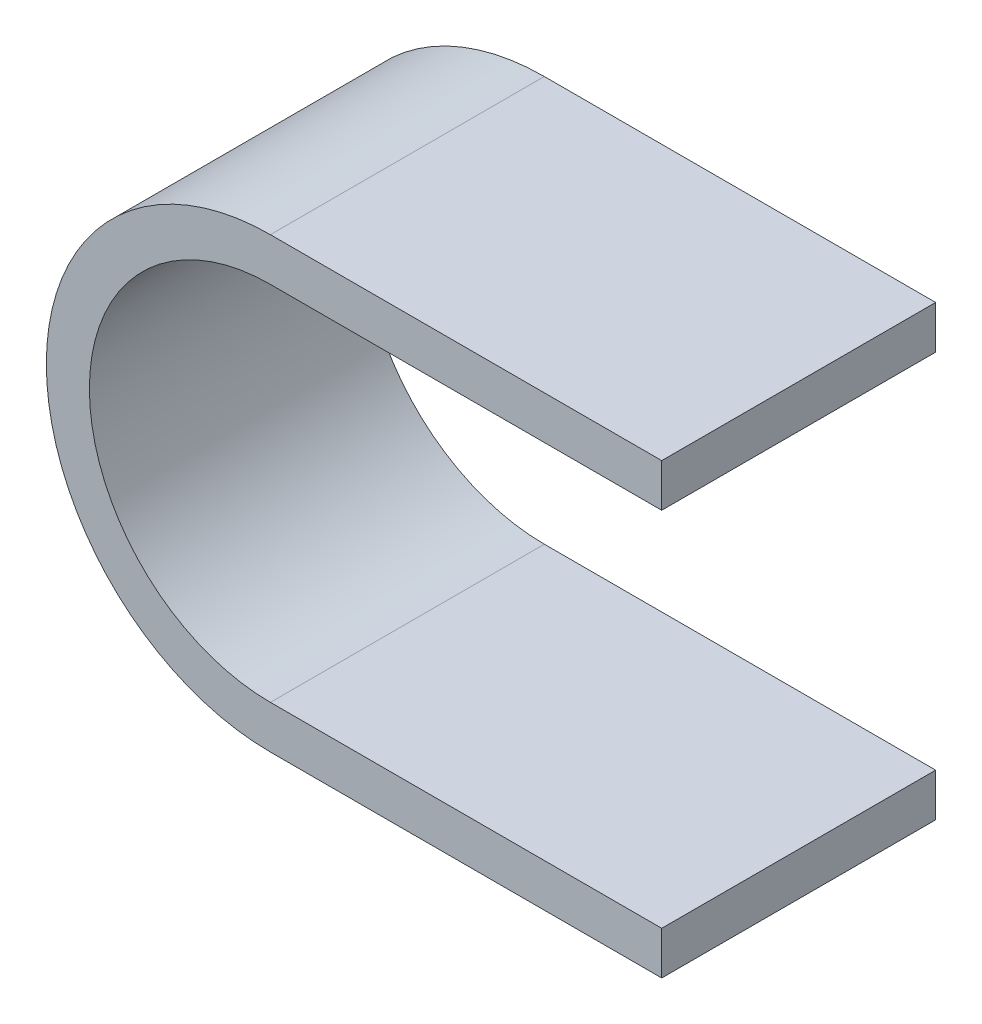
ISO-10303-21;
HEADER;
FILE_DESCRIPTION(('STEP AP214'),'2;1');
FILE_NAME('part.step','',(''),(''),'','','');
FILE_SCHEMA(('AUTOMOTIVE_DESIGN { 1 0 10303 214 1 1 1 1 }'));
ENDSEC;
DATA;
#1=APPLICATION_CONTEXT('core data for automotive mechanical design processes');
#2=APPLICATION_PROTOCOL_DEFINITION('international standard','automotive_design',2000,#1);
#3=PRODUCT_CONTEXT('',#1,'mechanical');
#4=PRODUCT('Part','Part','',(#3));
#5=PRODUCT_RELATED_PRODUCT_CATEGORY('part','',(#4));
#6=PRODUCT_DEFINITION_FORMATION('','',#4);
#7=PRODUCT_DEFINITION_CONTEXT('part definition',#1,'design');
#8=PRODUCT_DEFINITION('design','',#6,#7);
#9=PRODUCT_DEFINITION_SHAPE('','',#8);
#10=(LENGTH_UNIT() NAMED_UNIT(*) SI_UNIT(.MILLI.,.METRE.));
#11=(NAMED_UNIT(*) PLANE_ANGLE_UNIT() SI_UNIT($,.RADIAN.));
#12=(NAMED_UNIT(*) SI_UNIT($,.STERADIAN.) SOLID_ANGLE_UNIT());
#13=UNCERTAINTY_MEASURE_WITH_UNIT(LENGTH_MEASURE(1.E-05),#10,'distance_accuracy_value','');
#14=(GEOMETRIC_REPRESENTATION_CONTEXT(3) GLOBAL_UNCERTAINTY_ASSIGNED_CONTEXT((#13)) GLOBAL_UNIT_ASSIGNED_CONTEXT((#10,
#11,#12)) REPRESENTATION_CONTEXT('',''));
#15=CARTESIAN_POINT('',(0.,0.,0.));
#16=DIRECTION('',(0.,0.,1.));
#17=DIRECTION('',(1.,0.,0.));
#18=AXIS2_PLACEMENT_3D('',#15,#16,#17);
#19=CARTESIAN_POINT('',(0.,22.9,28.));
#20=DIRECTION('',(0.,1.,0.));
#21=DIRECTION('',(0.,0.,1.));
#22=AXIS2_PLACEMENT_3D('',#19,#20,#21);
#23=PLANE('',#22);
#24=DIRECTION('',(1.,0.,0.));
#25=VECTOR('',#24,1.);
#26=CARTESIAN_POINT('',(0.,22.9,0.));
#27=LINE('',#26,#25);
#28=CARTESIAN_POINT('',(0.,22.9,0.));
#29=VERTEX_POINT('',#28);
#30=CARTESIAN_POINT('',(40.,22.9,0.));
#31=VERTEX_POINT('',#30);
#32=EDGE_CURVE('E146',#29,#31,#27,.T.);
#33=ORIENTED_EDGE('',*,*,#32,.F.);
#34=DIRECTION('',(0.,0.,-1.));
#35=VECTOR('',#34,1.);
#36=CARTESIAN_POINT('',(0.,22.9,28.));
#37=LINE('',#36,#35);
#38=CARTESIAN_POINT('',(0.,22.9,28.));
#39=VERTEX_POINT('',#38);
#40=EDGE_CURVE('E11',#39,#29,#37,.T.);
#41=ORIENTED_EDGE('',*,*,#40,.F.);
#42=DIRECTION('',(1.,0.,0.));
#43=VECTOR('',#42,1.);
#44=CARTESIAN_POINT('',(0.,22.9,28.));
#45=LINE('',#44,#43);
#46=CARTESIAN_POINT('',(40.,22.9,28.));
#47=VERTEX_POINT('',#46);
#48=EDGE_CURVE('E172',#39,#47,#45,.T.);
#49=ORIENTED_EDGE('',*,*,#48,.T.);
#50=DIRECTION('',(0.,0.,-1.));
#51=VECTOR('',#50,1.);
#52=CARTESIAN_POINT('',(40.,22.9,28.));
#53=LINE('',#52,#51);
#54=EDGE_CURVE('E62',#47,#31,#53,.T.);
#55=ORIENTED_EDGE('',*,*,#54,.T.);
#56=EDGE_LOOP('',(#33,#41,#49,#55));
#57=FACE_BOUND('',#56,.T.);
#58=ADVANCED_FACE('F45',(#57),#23,.T.);
#59=CARTESIAN_POINT('',(0.,0.,28.));
#60=DIRECTION('',(0.,0.,-1.));
#61=DIRECTION('',(-1.,0.,0.));
#62=AXIS2_PLACEMENT_3D('',#59,#60,#61);
#63=CYLINDRICAL_SURFACE('',#62,22.9);
#64=CARTESIAN_POINT('',(0.,0.,0.));
#65=DIRECTION('',(0.,0.,1.));
#66=DIRECTION('',(1.,0.,0.));
#67=AXIS2_PLACEMENT_3D('',#64,#65,#66);
#68=CIRCLE('',#67,22.9);
#69=CARTESIAN_POINT('',(0.,-22.9,0.));
#70=VERTEX_POINT('',#69);
#71=EDGE_CURVE('E149',#29,#70,#68,.T.);
#72=ORIENTED_EDGE('',*,*,#71,.T.);
#73=DIRECTION('',(0.,0.,-1.));
#74=VECTOR('',#73,1.);
#75=CARTESIAN_POINT('',(0.,-22.9,28.));
#76=LINE('',#75,#74);
#77=CARTESIAN_POINT('',(0.,-22.9,28.));
#78=VERTEX_POINT('',#77);
#79=EDGE_CURVE('E54',#78,#70,#76,.T.);
#80=ORIENTED_EDGE('',*,*,#79,.F.);
#81=CARTESIAN_POINT('',(0.,0.,28.));
#82=DIRECTION('',(0.,0.,1.));
#83=DIRECTION('',(1.,0.,0.));
#84=AXIS2_PLACEMENT_3D('',#81,#82,#83);
#85=CIRCLE('',#84,22.9);
#86=EDGE_CURVE('E206',#39,#78,#85,.T.);
#87=ORIENTED_EDGE('',*,*,#86,.F.);
#88=ORIENTED_EDGE('',*,*,#40,.T.);
#89=EDGE_LOOP('',(#72,#80,#87,#88));
#90=FACE_BOUND('',#89,.T.);
#91=ADVANCED_FACE('F223',(#90),#63,.T.);
#92=CARTESIAN_POINT('',(0.,-22.9,28.));
#93=DIRECTION('',(0.,1.,0.));
#94=DIRECTION('',(0.,0.,1.));
#95=AXIS2_PLACEMENT_3D('',#92,#93,#94);
#96=PLANE('',#95);
#97=DIRECTION('',(1.,0.,0.));
#98=VECTOR('',#97,1.);
#99=CARTESIAN_POINT('',(0.,-22.9,0.));
#100=LINE('',#99,#98);
#101=CARTESIAN_POINT('',(40.,-22.9,0.));
#102=VERTEX_POINT('',#101);
#103=EDGE_CURVE('E152',#70,#102,#100,.T.);
#104=ORIENTED_EDGE('',*,*,#103,.T.);
#105=DIRECTION('',(0.,0.,-1.));
#106=VECTOR('',#105,1.);
#107=CARTESIAN_POINT('',(40.,-22.9,28.));
#108=LINE('',#107,#106);
#109=CARTESIAN_POINT('',(40.,-22.9,28.));
#110=VERTEX_POINT('',#109);
#111=EDGE_CURVE('E182',#110,#102,#108,.T.);
#112=ORIENTED_EDGE('',*,*,#111,.F.);
#113=DIRECTION('',(1.,0.,0.));
#114=VECTOR('',#113,1.);
#115=CARTESIAN_POINT('',(0.,-22.9,28.));
#116=LINE('',#115,#114);
#117=EDGE_CURVE('E193',#78,#110,#116,.T.);
#118=ORIENTED_EDGE('',*,*,#117,.F.);
#119=ORIENTED_EDGE('',*,*,#79,.T.);
#120=EDGE_LOOP('',(#104,#112,#118,#119));
#121=FACE_BOUND('',#120,.T.);
#122=ADVANCED_FACE('F191',(#121),#96,.F.);
#123=CARTESIAN_POINT('',(40.,0.,28.));
#124=DIRECTION('',(-1.,0.,0.));
#125=DIRECTION('',(0.,0.,1.));
#126=AXIS2_PLACEMENT_3D('',#123,#124,#125);
#127=PLANE('',#126);
#128=DIRECTION('',(0.,1.,0.));
#129=VECTOR('',#128,1.);
#130=CARTESIAN_POINT('',(40.,0.,0.));
#131=LINE('',#130,#129);
#132=CARTESIAN_POINT('',(40.,-18.5,0.));
#133=VERTEX_POINT('',#132);
#134=EDGE_CURVE('E155',#102,#133,#131,.T.);
#135=ORIENTED_EDGE('',*,*,#134,.T.);
#136=DIRECTION('',(0.,0.,-1.));
#137=VECTOR('',#136,1.);
#138=CARTESIAN_POINT('',(40.,-18.5,28.));
#139=LINE('',#138,#137);
#140=CARTESIAN_POINT('',(40.,-18.5,28.));
#141=VERTEX_POINT('',#140);
#142=EDGE_CURVE('E179',#141,#133,#139,.T.);
#143=ORIENTED_EDGE('',*,*,#142,.F.);
#144=DIRECTION('',(0.,1.,0.));
#145=VECTOR('',#144,1.);
#146=CARTESIAN_POINT('',(40.,0.,28.));
#147=LINE('',#146,#145);
#148=EDGE_CURVE('E140',#110,#141,#147,.T.);
#149=ORIENTED_EDGE('',*,*,#148,.F.);
#150=ORIENTED_EDGE('',*,*,#111,.T.);
#151=EDGE_LOOP('',(#135,#143,#149,#150));
#152=FACE_BOUND('',#151,.T.);
#153=ADVANCED_FACE('F202',(#152),#127,.F.);
#154=CARTESIAN_POINT('',(0.,-18.5,28.));
#155=DIRECTION('',(0.,1.,0.));
#156=DIRECTION('',(0.,0.,1.));
#157=AXIS2_PLACEMENT_3D('',#154,#155,#156);
#158=PLANE('',#157);
#159=DIRECTION('',(1.,0.,0.));
#160=VECTOR('',#159,1.);
#161=CARTESIAN_POINT('',(0.,-18.5,0.));
#162=LINE('',#161,#160);
#163=CARTESIAN_POINT('',(0.,-18.5,0.));
#164=VERTEX_POINT('',#163);
#165=EDGE_CURVE('E159',#164,#133,#162,.T.);
#166=ORIENTED_EDGE('',*,*,#165,.F.);
#167=DIRECTION('',(0.,0.,-1.));
#168=VECTOR('',#167,1.);
#169=CARTESIAN_POINT('',(0.,-18.5,28.));
#170=LINE('',#169,#168);
#171=CARTESIAN_POINT('',(0.,-18.5,28.));
#172=VERTEX_POINT('',#171);
#173=EDGE_CURVE('E123',#172,#164,#170,.T.);
#174=ORIENTED_EDGE('',*,*,#173,.F.);
#175=DIRECTION('',(1.,0.,0.));
#176=VECTOR('',#175,1.);
#177=CARTESIAN_POINT('',(0.,-18.5,28.));
#178=LINE('',#177,#176);
#179=EDGE_CURVE('E136',#172,#141,#178,.T.);
#180=ORIENTED_EDGE('',*,*,#179,.T.);
#181=ORIENTED_EDGE('',*,*,#142,.T.);
#182=EDGE_LOOP('',(#166,#174,#180,#181));
#183=FACE_BOUND('',#182,.T.);
#184=ADVANCED_FACE('F234',(#183),#158,.T.);
#185=CARTESIAN_POINT('',(0.,0.,28.));
#186=DIRECTION('',(0.,0.,-1.));
#187=DIRECTION('',(-1.,0.,0.));
#188=AXIS2_PLACEMENT_3D('',#185,#186,#187);
#189=CYLINDRICAL_SURFACE('',#188,18.5);
#190=CARTESIAN_POINT('',(0.,0.,0.));
#191=DIRECTION('',(0.,0.,1.));
#192=DIRECTION('',(1.,0.,0.));
#193=AXIS2_PLACEMENT_3D('',#190,#191,#192);
#194=CIRCLE('',#193,18.5);
#195=CARTESIAN_POINT('',(0.,18.5,0.));
#196=VERTEX_POINT('',#195);
#197=EDGE_CURVE('E119',#196,#164,#194,.T.);
#198=ORIENTED_EDGE('',*,*,#197,.F.);
#199=DIRECTION('',(0.,0.,-1.));
#200=VECTOR('',#199,1.);
#201=CARTESIAN_POINT('',(0.,18.5,28.));
#202=LINE('',#201,#200);
#203=CARTESIAN_POINT('',(0.,18.5,28.));
#204=VERTEX_POINT('',#203);
#205=EDGE_CURVE('E113',#204,#196,#202,.T.);
#206=ORIENTED_EDGE('',*,*,#205,.F.);
#207=CARTESIAN_POINT('',(0.,0.,28.));
#208=DIRECTION('',(0.,0.,1.));
#209=DIRECTION('',(1.,0.,0.));
#210=AXIS2_PLACEMENT_3D('',#207,#208,#209);
#211=CIRCLE('',#210,18.5);
#212=EDGE_CURVE('E117',#204,#172,#211,.T.);
#213=ORIENTED_EDGE('',*,*,#212,.T.);
#214=ORIENTED_EDGE('',*,*,#173,.T.);
#215=EDGE_LOOP('',(#198,#206,#213,#214));
#216=FACE_BOUND('',#215,.T.);
#217=ADVANCED_FACE('F115',(#216),#189,.F.);
#218=CARTESIAN_POINT('',(0.,18.5,28.));
#219=DIRECTION('',(0.,1.,0.));
#220=DIRECTION('',(0.,0.,1.));
#221=AXIS2_PLACEMENT_3D('',#218,#219,#220);
#222=PLANE('',#221);
#223=DIRECTION('',(1.,0.,0.));
#224=VECTOR('',#223,1.);
#225=CARTESIAN_POINT('',(0.,18.5,0.));
#226=LINE('',#225,#224);
#227=CARTESIAN_POINT('',(40.,18.5,0.));
#228=VERTEX_POINT('',#227);
#229=EDGE_CURVE('E165',#196,#228,#226,.T.);
#230=ORIENTED_EDGE('',*,*,#229,.T.);
#231=DIRECTION('',(0.,0.,-1.));
#232=VECTOR('',#231,1.);
#233=CARTESIAN_POINT('',(40.,18.5,28.));
#234=LINE('',#233,#232);
#235=CARTESIAN_POINT('',(40.,18.5,28.));
#236=VERTEX_POINT('',#235);
#237=EDGE_CURVE('E88',#236,#228,#234,.T.);
#238=ORIENTED_EDGE('',*,*,#237,.F.);
#239=DIRECTION('',(1.,0.,0.));
#240=VECTOR('',#239,1.);
#241=CARTESIAN_POINT('',(0.,18.5,28.));
#242=LINE('',#241,#240);
#243=EDGE_CURVE('E125',#204,#236,#242,.T.);
#244=ORIENTED_EDGE('',*,*,#243,.F.);
#245=ORIENTED_EDGE('',*,*,#205,.T.);
#246=EDGE_LOOP('',(#230,#238,#244,#245));
#247=FACE_BOUND('',#246,.T.);
#248=ADVANCED_FACE('F126',(#247),#222,.F.);
#249=CARTESIAN_POINT('',(40.,0.,28.));
#250=DIRECTION('',(1.,0.,0.));
#251=DIRECTION('',(0.,0.,-1.));
#252=AXIS2_PLACEMENT_3D('',#249,#250,#251);
#253=PLANE('',#252);
#254=DIRECTION('',(0.,-1.,0.));
#255=VECTOR('',#254,1.);
#256=CARTESIAN_POINT('',(40.,0.,0.));
#257=LINE('',#256,#255);
#258=EDGE_CURVE('E168',#31,#228,#257,.T.);
#259=ORIENTED_EDGE('',*,*,#258,.F.);
#260=ORIENTED_EDGE('',*,*,#54,.F.);
#261=DIRECTION('',(0.,-1.,0.));
#262=VECTOR('',#261,1.);
#263=CARTESIAN_POINT('',(40.,0.,28.));
#264=LINE('',#263,#262);
#265=EDGE_CURVE('E130',#47,#236,#264,.T.);
#266=ORIENTED_EDGE('',*,*,#265,.T.);
#267=ORIENTED_EDGE('',*,*,#237,.T.);
#268=EDGE_LOOP('',(#259,#260,#266,#267));
#269=FACE_BOUND('',#268,.T.);
#270=ADVANCED_FACE('F212',(#269),#253,.T.);
#271=CARTESIAN_POINT('',(0.,0.,28.));
#272=DIRECTION('',(0.,0.,1.));
#273=DIRECTION('',(1.,0.,0.));
#274=AXIS2_PLACEMENT_3D('',#271,#272,#273);
#275=PLANE('',#274);
#276=ORIENTED_EDGE('',*,*,#48,.F.);
#277=ORIENTED_EDGE('',*,*,#86,.T.);
#278=ORIENTED_EDGE('',*,*,#117,.T.);
#279=ORIENTED_EDGE('',*,*,#148,.T.);
#280=ORIENTED_EDGE('',*,*,#179,.F.);
#281=ORIENTED_EDGE('',*,*,#212,.F.);
#282=ORIENTED_EDGE('',*,*,#243,.T.);
#283=ORIENTED_EDGE('',*,*,#265,.F.);
#284=EDGE_LOOP('',(#276,#277,#278,#279,#280,#281,#282,#283));
#285=FACE_BOUND('',#284,.T.);
#286=ADVANCED_FACE('F134',(#285),#275,.T.);
#287=CARTESIAN_POINT('',(0.,0.,0.));
#288=DIRECTION('',(0.,0.,1.));
#289=DIRECTION('',(1.,0.,0.));
#290=AXIS2_PLACEMENT_3D('',#287,#288,#289);
#291=PLANE('',#290);
#292=ORIENTED_EDGE('',*,*,#32,.T.);
#293=ORIENTED_EDGE('',*,*,#258,.T.);
#294=ORIENTED_EDGE('',*,*,#229,.F.);
#295=ORIENTED_EDGE('',*,*,#197,.T.);
#296=ORIENTED_EDGE('',*,*,#165,.T.);
#297=ORIENTED_EDGE('',*,*,#134,.F.);
#298=ORIENTED_EDGE('',*,*,#103,.F.);
#299=ORIENTED_EDGE('',*,*,#71,.F.);
#300=EDGE_LOOP('',(#292,#293,#294,#295,#296,#297,#298,#299));
#301=FACE_BOUND('',#300,.T.);
#302=ADVANCED_FACE('F198',(#301),#291,.F.);
#303=CLOSED_SHELL('',(#58,#91,#122,#153,#184,#217,#248,#270,#286,#302));
#304=MANIFOLD_SOLID_BREP('B2',#303);
#305=ADVANCED_BREP_SHAPE_REPRESENTATION('',(#18,#304),#14);
#306=SHAPE_DEFINITION_REPRESENTATION(#9,#305);
ENDSEC;
END-ISO-10303-21;
